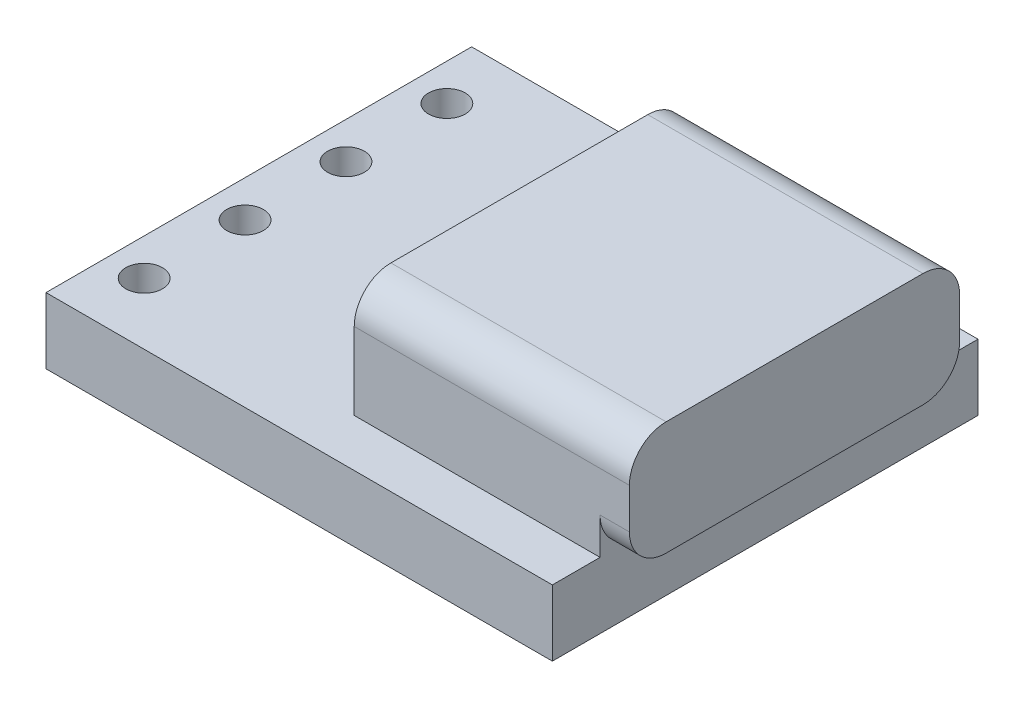
ISO-10303-21;
HEADER;
FILE_DESCRIPTION(('STEP AP214'),'2;1');
FILE_NAME('part.step','',(''),(''),'','','');
FILE_SCHEMA(('AUTOMOTIVE_DESIGN { 1 0 10303 214 1 1 1 1 }'));
ENDSEC;
DATA;
#1=APPLICATION_CONTEXT('core data for automotive mechanical design processes');
#2=APPLICATION_PROTOCOL_DEFINITION('international standard','automotive_design',2000,#1);
#3=PRODUCT_CONTEXT('',#1,'mechanical');
#4=PRODUCT('Part','Part','',(#3));
#5=PRODUCT_RELATED_PRODUCT_CATEGORY('part','',(#4));
#6=PRODUCT_DEFINITION_FORMATION('','',#4);
#7=PRODUCT_DEFINITION_CONTEXT('part definition',#1,'design');
#8=PRODUCT_DEFINITION('design','',#6,#7);
#9=PRODUCT_DEFINITION_SHAPE('','',#8);
#10=(LENGTH_UNIT() NAMED_UNIT(*) SI_UNIT(.MILLI.,.METRE.));
#11=(NAMED_UNIT(*) PLANE_ANGLE_UNIT() SI_UNIT($,.RADIAN.));
#12=(NAMED_UNIT(*) SI_UNIT($,.STERADIAN.) SOLID_ANGLE_UNIT());
#13=UNCERTAINTY_MEASURE_WITH_UNIT(LENGTH_MEASURE(1.E-05),#10,'distance_accuracy_value','');
#14=(GEOMETRIC_REPRESENTATION_CONTEXT(3) GLOBAL_UNCERTAINTY_ASSIGNED_CONTEXT((#13)) GLOBAL_UNIT_ASSIGNED_CONTEXT((#10,
#11,#12)) REPRESENTATION_CONTEXT('',''));
#15=CARTESIAN_POINT('',(0.,0.,0.));
#16=DIRECTION('',(0.,0.,1.));
#17=DIRECTION('',(1.,0.,0.));
#18=AXIS2_PLACEMENT_3D('',#15,#16,#17);
#19=CARTESIAN_POINT('',(6.9,1.8,-5.8));
#20=DIRECTION('',(-1.,0.,0.));
#21=DIRECTION('',(0.,0.,1.));
#22=AXIS2_PLACEMENT_3D('',#19,#20,#21);
#23=PLANE('',#22);
#24=DIRECTION('',(0.,0.,-1.));
#25=VECTOR('',#24,1.);
#26=CARTESIAN_POINT('',(6.9,1.8,-5.8));
#27=LINE('',#26,#25);
#28=CARTESIAN_POINT('',(6.9,1.8,-4.5));
#29=VERTEX_POINT('',#28);
#30=CARTESIAN_POINT('',(6.9,1.8,-5.8));
#31=VERTEX_POINT('',#30);
#32=EDGE_CURVE('E156',#29,#31,#27,.T.);
#33=ORIENTED_EDGE('',*,*,#32,.F.);
#34=DIRECTION('',(0.,-1.,0.));
#35=VECTOR('',#34,1.);
#36=CARTESIAN_POINT('',(6.9,4.9,-4.5));
#37=LINE('',#36,#35);
#38=CARTESIAN_POINT('',(6.9,2.8,-4.5));
#39=VERTEX_POINT('',#38);
#40=EDGE_CURVE('E140',#39,#29,#37,.T.);
#41=ORIENTED_EDGE('',*,*,#40,.F.);
#42=CARTESIAN_POINT('',(6.9,2.8,-3.5));
#43=DIRECTION('',(-1.,0.,0.));
#44=DIRECTION('',(0.,0.,1.));
#45=AXIS2_PLACEMENT_3D('',#42,#43,#44);
#46=CIRCLE('',#45,1.);
#47=CARTESIAN_POINT('',(6.9,1.8,-3.5));
#48=VERTEX_POINT('',#47);
#49=EDGE_CURVE('E45',#39,#48,#46,.T.);
#50=ORIENTED_EDGE('',*,*,#49,.T.);
#51=DIRECTION('',(0.,0.,1.));
#52=VECTOR('',#51,1.);
#53=CARTESIAN_POINT('',(6.9,1.8,4.5));
#54=LINE('',#53,#52);
#55=CARTESIAN_POINT('',(6.9,1.8,3.5));
#56=VERTEX_POINT('',#55);
#57=EDGE_CURVE('E227',#48,#56,#54,.T.);
#58=ORIENTED_EDGE('',*,*,#57,.T.);
#59=CARTESIAN_POINT('',(6.9,2.8,3.5));
#60=DIRECTION('',(-1.,0.,0.));
#61=DIRECTION('',(0.,0.,1.));
#62=AXIS2_PLACEMENT_3D('',#59,#60,#61);
#63=CIRCLE('',#62,1.);
#64=CARTESIAN_POINT('',(6.9,2.8,4.5));
#65=VERTEX_POINT('',#64);
#66=EDGE_CURVE('E11',#56,#65,#63,.T.);
#67=ORIENTED_EDGE('',*,*,#66,.T.);
#68=DIRECTION('',(0.,1.,0.));
#69=VECTOR('',#68,1.);
#70=CARTESIAN_POINT('',(6.9,4.9,4.5));
#71=LINE('',#70,#69);
#72=CARTESIAN_POINT('',(6.9,1.8,4.5));
#73=VERTEX_POINT('',#72);
#74=EDGE_CURVE('E51',#73,#65,#71,.T.);
#75=ORIENTED_EDGE('',*,*,#74,.F.);
#76=CARTESIAN_POINT('',(6.9,1.8,5.8));
#77=VERTEX_POINT('',#76);
#78=EDGE_CURVE('E167',#77,#73,#27,.T.);
#79=ORIENTED_EDGE('',*,*,#78,.F.);
#80=DIRECTION('',(0.,-1.,0.));
#81=VECTOR('',#80,1.);
#82=CARTESIAN_POINT('',(6.9,1.8,5.8));
#83=LINE('',#82,#81);
#84=CARTESIAN_POINT('',(6.9,0.,5.8));
#85=VERTEX_POINT('',#84);
#86=EDGE_CURVE('E181',#77,#85,#83,.T.);
#87=ORIENTED_EDGE('',*,*,#86,.T.);
#88=DIRECTION('',(0.,0.,-1.));
#89=VECTOR('',#88,1.);
#90=CARTESIAN_POINT('',(6.9,0.,-5.8));
#91=LINE('',#90,#89);
#92=CARTESIAN_POINT('',(6.9,0.,-5.8));
#93=VERTEX_POINT('',#92);
#94=EDGE_CURVE('E182',#85,#93,#91,.T.);
#95=ORIENTED_EDGE('',*,*,#94,.T.);
#96=DIRECTION('',(0.,-1.,0.));
#97=VECTOR('',#96,1.);
#98=CARTESIAN_POINT('',(6.9,1.8,-5.8));
#99=LINE('',#98,#97);
#100=EDGE_CURVE('E166',#31,#93,#99,.T.);
#101=ORIENTED_EDGE('',*,*,#100,.F.);
#102=EDGE_LOOP('',(#33,#41,#50,#58,#67,#75,#79,#87,#95,#101));
#103=FACE_BOUND('',#102,.T.);
#104=ADVANCED_FACE('F37',(#103),#23,.F.);
#105=CARTESIAN_POINT('',(0.,1.8,0.));
#106=DIRECTION('',(0.,1.,0.));
#107=DIRECTION('',(0.,0.,1.));
#108=AXIS2_PLACEMENT_3D('',#105,#106,#107);
#109=PLANE('',#108);
#110=CARTESIAN_POINT('',(-5.9,1.8,-4.125));
#111=DIRECTION('',(0.,1.,0.));
#112=DIRECTION('',(0.,0.,1.));
#113=AXIS2_PLACEMENT_3D('',#110,#111,#112);
#114=CIRCLE('',#113,0.500000000000002);
#115=CARTESIAN_POINT('',(-5.9,1.8,-3.625));
#116=VERTEX_POINT('',#115);
#117=EDGE_CURVE('E289',#116,#116,#114,.T.);
#118=ORIENTED_EDGE('',*,*,#117,.F.);
#119=EDGE_LOOP('',(#118));
#120=FACE_BOUND('',#119,.T.);
#121=CARTESIAN_POINT('',(-5.89999999999997,1.8,-1.375));
#122=DIRECTION('',(0.,1.,0.));
#123=DIRECTION('',(0.,0.,1.));
#124=AXIS2_PLACEMENT_3D('',#121,#122,#123);
#125=CIRCLE('',#124,0.500000000000002);
#126=CARTESIAN_POINT('',(-5.89999999999997,1.8,-0.874999999999998));
#127=VERTEX_POINT('',#126);
#128=EDGE_CURVE('E283',#127,#127,#125,.T.);
#129=ORIENTED_EDGE('',*,*,#128,.F.);
#130=EDGE_LOOP('',(#129));
#131=FACE_BOUND('',#130,.T.);
#132=CARTESIAN_POINT('',(-5.89999999999994,1.8,1.375));
#133=DIRECTION('',(0.,1.,0.));
#134=DIRECTION('',(0.,0.,1.));
#135=AXIS2_PLACEMENT_3D('',#132,#133,#134);
#136=CIRCLE('',#135,0.500000000000001);
#137=CARTESIAN_POINT('',(-5.89999999999994,1.8,1.875));
#138=VERTEX_POINT('',#137);
#139=EDGE_CURVE('E276',#138,#138,#136,.T.);
#140=ORIENTED_EDGE('',*,*,#139,.F.);
#141=EDGE_LOOP('',(#140));
#142=FACE_BOUND('',#141,.T.);
#143=CARTESIAN_POINT('',(-5.89999999999991,1.8,4.125));
#144=DIRECTION('',(0.,1.,0.));
#145=DIRECTION('',(0.,0.,1.));
#146=AXIS2_PLACEMENT_3D('',#143,#144,#145);
#147=CIRCLE('',#146,0.500000000000002);
#148=CARTESIAN_POINT('',(-5.89999999999991,1.8,4.625));
#149=VERTEX_POINT('',#148);
#150=EDGE_CURVE('E277',#149,#149,#147,.T.);
#151=ORIENTED_EDGE('',*,*,#150,.F.);
#152=EDGE_LOOP('',(#151));
#153=FACE_BOUND('',#152,.T.);
#154=ORIENTED_EDGE('',*,*,#78,.T.);
#155=DIRECTION('',(-1.,0.,0.));
#156=VECTOR('',#155,1.);
#157=CARTESIAN_POINT('',(0.,1.8,4.5));
#158=LINE('',#157,#156);
#159=CARTESIAN_POINT('',(0.200000000000003,1.8,4.5));
#160=VERTEX_POINT('',#159);
#161=EDGE_CURVE('E161',#73,#160,#158,.T.);
#162=ORIENTED_EDGE('',*,*,#161,.T.);
#163=DIRECTION('',(0.,0.,-1.));
#164=VECTOR('',#163,1.);
#165=CARTESIAN_POINT('',(0.200000000000003,1.8,0.));
#166=LINE('',#165,#164);
#167=CARTESIAN_POINT('',(0.200000000000003,1.8,-4.5));
#168=VERTEX_POINT('',#167);
#169=EDGE_CURVE('E160',#160,#168,#166,.T.);
#170=ORIENTED_EDGE('',*,*,#169,.T.);
#171=DIRECTION('',(1.,0.,0.));
#172=VECTOR('',#171,1.);
#173=CARTESIAN_POINT('',(0.,1.8,-4.5));
#174=LINE('',#173,#172);
#175=EDGE_CURVE('E145',#168,#29,#174,.T.);
#176=ORIENTED_EDGE('',*,*,#175,.T.);
#177=ORIENTED_EDGE('',*,*,#32,.T.);
#178=DIRECTION('',(-1.,0.,0.));
#179=VECTOR('',#178,1.);
#180=CARTESIAN_POINT('',(-6.9,1.8,-5.8));
#181=LINE('',#180,#179);
#182=CARTESIAN_POINT('',(-6.9,1.8,-5.8));
#183=VERTEX_POINT('',#182);
#184=EDGE_CURVE('E170',#31,#183,#181,.T.);
#185=ORIENTED_EDGE('',*,*,#184,.T.);
#186=DIRECTION('',(0.,0.,1.));
#187=VECTOR('',#186,1.);
#188=CARTESIAN_POINT('',(-6.9,1.8,-5.8));
#189=LINE('',#188,#187);
#190=CARTESIAN_POINT('',(-6.9,1.8,5.8));
#191=VERTEX_POINT('',#190);
#192=EDGE_CURVE('E177',#183,#191,#189,.T.);
#193=ORIENTED_EDGE('',*,*,#192,.T.);
#194=DIRECTION('',(1.,0.,0.));
#195=VECTOR('',#194,1.);
#196=CARTESIAN_POINT('',(-6.9,1.8,5.8));
#197=LINE('',#196,#195);
#198=EDGE_CURVE('E179',#191,#77,#197,.T.);
#199=ORIENTED_EDGE('',*,*,#198,.T.);
#200=EDGE_LOOP('',(#154,#162,#170,#176,#177,#185,#193,#199));
#201=FACE_BOUND('',#200,.T.);
#202=ADVANCED_FACE('F155',(#120,#131,#142,#153,#201),#109,.T.);
#203=CARTESIAN_POINT('',(-6.9,1.8,-5.8));
#204=DIRECTION('',(0.,0.,1.));
#205=DIRECTION('',(1.,0.,0.));
#206=AXIS2_PLACEMENT_3D('',#203,#204,#205);
#207=PLANE('',#206);
#208=DIRECTION('',(-1.,0.,0.));
#209=VECTOR('',#208,1.);
#210=CARTESIAN_POINT('',(-6.9,0.,-5.8));
#211=LINE('',#210,#209);
#212=CARTESIAN_POINT('',(-6.9,0.,-5.8));
#213=VERTEX_POINT('',#212);
#214=EDGE_CURVE('E184',#93,#213,#211,.T.);
#215=ORIENTED_EDGE('',*,*,#214,.T.);
#216=DIRECTION('',(0.,-1.,0.));
#217=VECTOR('',#216,1.);
#218=CARTESIAN_POINT('',(-6.9,1.8,-5.8));
#219=LINE('',#218,#217);
#220=EDGE_CURVE('E192',#183,#213,#219,.T.);
#221=ORIENTED_EDGE('',*,*,#220,.F.);
#222=ORIENTED_EDGE('',*,*,#184,.F.);
#223=ORIENTED_EDGE('',*,*,#100,.T.);
#224=EDGE_LOOP('',(#215,#221,#222,#223));
#225=FACE_BOUND('',#224,.T.);
#226=ADVANCED_FACE('F302',(#225),#207,.F.);
#227=CARTESIAN_POINT('',(-6.9,1.8,-5.8));
#228=DIRECTION('',(1.,0.,0.));
#229=DIRECTION('',(0.,0.,-1.));
#230=AXIS2_PLACEMENT_3D('',#227,#228,#229);
#231=PLANE('',#230);
#232=DIRECTION('',(0.,0.,1.));
#233=VECTOR('',#232,1.);
#234=CARTESIAN_POINT('',(-6.9,0.,-5.8));
#235=LINE('',#234,#233);
#236=CARTESIAN_POINT('',(-6.9,0.,5.8));
#237=VERTEX_POINT('',#236);
#238=EDGE_CURVE('E171',#213,#237,#235,.T.);
#239=ORIENTED_EDGE('',*,*,#238,.T.);
#240=DIRECTION('',(0.,-1.,0.));
#241=VECTOR('',#240,1.);
#242=CARTESIAN_POINT('',(-6.9,1.8,5.8));
#243=LINE('',#242,#241);
#244=EDGE_CURVE('E189',#191,#237,#243,.T.);
#245=ORIENTED_EDGE('',*,*,#244,.F.);
#246=ORIENTED_EDGE('',*,*,#192,.F.);
#247=ORIENTED_EDGE('',*,*,#220,.T.);
#248=EDGE_LOOP('',(#239,#245,#246,#247));
#249=FACE_BOUND('',#248,.T.);
#250=ADVANCED_FACE('F334',(#249),#231,.F.);
#251=CARTESIAN_POINT('',(-6.9,1.8,5.8));
#252=DIRECTION('',(0.,0.,-1.));
#253=DIRECTION('',(-1.,0.,0.));
#254=AXIS2_PLACEMENT_3D('',#251,#252,#253);
#255=PLANE('',#254);
#256=DIRECTION('',(1.,0.,0.));
#257=VECTOR('',#256,1.);
#258=CARTESIAN_POINT('',(-6.9,0.,5.8));
#259=LINE('',#258,#257);
#260=EDGE_CURVE('E168',#237,#85,#259,.T.);
#261=ORIENTED_EDGE('',*,*,#260,.T.);
#262=ORIENTED_EDGE('',*,*,#86,.F.);
#263=ORIENTED_EDGE('',*,*,#198,.F.);
#264=ORIENTED_EDGE('',*,*,#244,.T.);
#265=EDGE_LOOP('',(#261,#262,#263,#264));
#266=FACE_BOUND('',#265,.T.);
#267=ADVANCED_FACE('F320',(#266),#255,.F.);
#268=CARTESIAN_POINT('',(0.,0.,0.));
#269=DIRECTION('',(0.,1.,0.));
#270=DIRECTION('',(0.,0.,1.));
#271=AXIS2_PLACEMENT_3D('',#268,#269,#270);
#272=PLANE('',#271);
#273=CARTESIAN_POINT('',(-5.9,0.,-4.125));
#274=DIRECTION('',(0.,1.,0.));
#275=DIRECTION('',(0.,0.,1.));
#276=AXIS2_PLACEMENT_3D('',#273,#274,#275);
#277=CIRCLE('',#276,0.500000000000002);
#278=CARTESIAN_POINT('',(-5.9,0.,-3.625));
#279=VERTEX_POINT('',#278);
#280=EDGE_CURVE('E272',#279,#279,#277,.F.);
#281=ORIENTED_EDGE('',*,*,#280,.F.);
#282=EDGE_LOOP('',(#281));
#283=FACE_BOUND('',#282,.T.);
#284=CARTESIAN_POINT('',(-5.89999999999997,0.,-1.375));
#285=DIRECTION('',(0.,1.,0.));
#286=DIRECTION('',(0.,0.,1.));
#287=AXIS2_PLACEMENT_3D('',#284,#285,#286);
#288=CIRCLE('',#287,0.500000000000002);
#289=CARTESIAN_POINT('',(-5.89999999999997,0.,-0.874999999999998));
#290=VERTEX_POINT('',#289);
#291=EDGE_CURVE('E286',#290,#290,#288,.F.);
#292=ORIENTED_EDGE('',*,*,#291,.F.);
#293=EDGE_LOOP('',(#292));
#294=FACE_BOUND('',#293,.T.);
#295=CARTESIAN_POINT('',(-5.89999999999994,0.,1.375));
#296=DIRECTION('',(0.,1.,0.));
#297=DIRECTION('',(0.,0.,1.));
#298=AXIS2_PLACEMENT_3D('',#295,#296,#297);
#299=CIRCLE('',#298,0.500000000000001);
#300=CARTESIAN_POINT('',(-5.89999999999994,0.,1.875));
#301=VERTEX_POINT('',#300);
#302=EDGE_CURVE('E280',#301,#301,#299,.F.);
#303=ORIENTED_EDGE('',*,*,#302,.F.);
#304=EDGE_LOOP('',(#303));
#305=FACE_BOUND('',#304,.T.);
#306=CARTESIAN_POINT('',(-5.89999999999991,0.,4.125));
#307=DIRECTION('',(0.,1.,0.));
#308=DIRECTION('',(0.,0.,1.));
#309=AXIS2_PLACEMENT_3D('',#306,#307,#308);
#310=CIRCLE('',#309,0.500000000000002);
#311=CARTESIAN_POINT('',(-5.89999999999991,0.,4.625));
#312=VERTEX_POINT('',#311);
#313=EDGE_CURVE('E273',#312,#312,#310,.F.);
#314=ORIENTED_EDGE('',*,*,#313,.F.);
#315=EDGE_LOOP('',(#314));
#316=FACE_BOUND('',#315,.T.);
#317=ORIENTED_EDGE('',*,*,#214,.F.);
#318=ORIENTED_EDGE('',*,*,#94,.F.);
#319=ORIENTED_EDGE('',*,*,#260,.F.);
#320=ORIENTED_EDGE('',*,*,#238,.F.);
#321=EDGE_LOOP('',(#317,#318,#319,#320));
#322=FACE_BOUND('',#321,.T.);
#323=ADVANCED_FACE('F317',(#283,#294,#305,#316,#322),#272,.F.);
#324=CARTESIAN_POINT('',(0.,4.9,4.5));
#325=DIRECTION('',(0.,0.,-1.));
#326=DIRECTION('',(-1.,0.,0.));
#327=AXIS2_PLACEMENT_3D('',#324,#325,#326);
#328=PLANE('',#327);
#329=ORIENTED_EDGE('',*,*,#74,.T.);
#330=DIRECTION('',(1.,0.,0.));
#331=VECTOR('',#330,1.);
#332=CARTESIAN_POINT('',(0.,2.8,4.5));
#333=LINE('',#332,#331);
#334=CARTESIAN_POINT('',(7.7,2.8,4.5));
#335=VERTEX_POINT('',#334);
#336=EDGE_CURVE('E214',#65,#335,#333,.T.);
#337=ORIENTED_EDGE('',*,*,#336,.T.);
#338=DIRECTION('',(0.,-1.,0.));
#339=VECTOR('',#338,1.);
#340=CARTESIAN_POINT('',(7.7,4.9,4.5));
#341=LINE('',#340,#339);
#342=CARTESIAN_POINT('',(7.7,3.9,4.5));
#343=VERTEX_POINT('',#342);
#344=EDGE_CURVE('E246',#343,#335,#341,.T.);
#345=ORIENTED_EDGE('',*,*,#344,.F.);
#346=DIRECTION('',(1.,0.,0.));
#347=VECTOR('',#346,1.);
#348=CARTESIAN_POINT('',(0.200000000000003,3.9,4.5));
#349=LINE('',#348,#347);
#350=CARTESIAN_POINT('',(0.200000000000003,3.9,4.5));
#351=VERTEX_POINT('',#350);
#352=EDGE_CURVE('E211',#343,#351,#349,.F.);
#353=ORIENTED_EDGE('',*,*,#352,.T.);
#354=DIRECTION('',(0.,-1.,0.));
#355=VECTOR('',#354,1.);
#356=CARTESIAN_POINT('',(0.200000000000003,4.9,4.5));
#357=LINE('',#356,#355);
#358=EDGE_CURVE('E162',#351,#160,#357,.T.);
#359=ORIENTED_EDGE('',*,*,#358,.T.);
#360=ORIENTED_EDGE('',*,*,#161,.F.);
#361=EDGE_LOOP('',(#329,#337,#345,#353,#359,#360));
#362=FACE_BOUND('',#361,.T.);
#363=ADVANCED_FACE('F256',(#362),#328,.F.);
#364=CARTESIAN_POINT('',(0.,4.9,-4.5));
#365=DIRECTION('',(0.,0.,1.));
#366=DIRECTION('',(1.,0.,0.));
#367=AXIS2_PLACEMENT_3D('',#364,#365,#366);
#368=PLANE('',#367);
#369=DIRECTION('',(0.,-1.,0.));
#370=VECTOR('',#369,1.);
#371=CARTESIAN_POINT('',(7.7,4.9,-4.5));
#372=LINE('',#371,#370);
#373=CARTESIAN_POINT('',(7.7,3.9,-4.5));
#374=VERTEX_POINT('',#373);
#375=CARTESIAN_POINT('',(7.7,2.8,-4.5));
#376=VERTEX_POINT('',#375);
#377=EDGE_CURVE('E243',#374,#376,#372,.T.);
#378=ORIENTED_EDGE('',*,*,#377,.T.);
#379=DIRECTION('',(1.,0.,0.));
#380=VECTOR('',#379,1.);
#381=CARTESIAN_POINT('',(0.,2.8,-4.5));
#382=LINE('',#381,#380);
#383=EDGE_CURVE('E148',#376,#39,#382,.F.);
#384=ORIENTED_EDGE('',*,*,#383,.T.);
#385=ORIENTED_EDGE('',*,*,#40,.T.);
#386=ORIENTED_EDGE('',*,*,#175,.F.);
#387=DIRECTION('',(0.,-1.,0.));
#388=VECTOR('',#387,1.);
#389=CARTESIAN_POINT('',(0.200000000000003,4.9,-4.5));
#390=LINE('',#389,#388);
#391=CARTESIAN_POINT('',(0.200000000000003,3.9,-4.5));
#392=VERTEX_POINT('',#391);
#393=EDGE_CURVE('E247',#392,#168,#390,.T.);
#394=ORIENTED_EDGE('',*,*,#393,.F.);
#395=DIRECTION('',(-1.,0.,0.));
#396=VECTOR('',#395,1.);
#397=CARTESIAN_POINT('',(7.7,3.9,-4.5));
#398=LINE('',#397,#396);
#399=EDGE_CURVE('E151',#392,#374,#398,.F.);
#400=ORIENTED_EDGE('',*,*,#399,.T.);
#401=EDGE_LOOP('',(#378,#384,#385,#386,#394,#400));
#402=FACE_BOUND('',#401,.T.);
#403=ADVANCED_FACE('F143',(#402),#368,.F.);
#404=CARTESIAN_POINT('',(0.200000000000003,4.9,0.));
#405=DIRECTION('',(1.,0.,0.));
#406=DIRECTION('',(0.,0.,-1.));
#407=AXIS2_PLACEMENT_3D('',#404,#405,#406);
#408=PLANE('',#407);
#409=DIRECTION('',(0.,0.,1.));
#410=VECTOR('',#409,1.);
#411=CARTESIAN_POINT('',(0.200000000000003,4.9,0.));
#412=LINE('',#411,#410);
#413=CARTESIAN_POINT('',(0.200000000000003,4.9,-3.5));
#414=VERTEX_POINT('',#413);
#415=CARTESIAN_POINT('',(0.200000000000003,4.9,3.5));
#416=VERTEX_POINT('',#415);
#417=EDGE_CURVE('E236',#414,#416,#412,.T.);
#418=ORIENTED_EDGE('',*,*,#417,.F.);
#419=CARTESIAN_POINT('',(0.200000000000003,3.9,-3.5));
#420=DIRECTION('',(1.,0.,0.));
#421=DIRECTION('',(0.,0.,-1.));
#422=AXIS2_PLACEMENT_3D('',#419,#420,#421);
#423=CIRCLE('',#422,1.);
#424=EDGE_CURVE('E224',#414,#392,#423,.F.);
#425=ORIENTED_EDGE('',*,*,#424,.T.);
#426=ORIENTED_EDGE('',*,*,#393,.T.);
#427=ORIENTED_EDGE('',*,*,#169,.F.);
#428=ORIENTED_EDGE('',*,*,#358,.F.);
#429=CARTESIAN_POINT('',(0.200000000000003,3.9,3.5));
#430=DIRECTION('',(1.,0.,0.));
#431=DIRECTION('',(0.,0.,-1.));
#432=AXIS2_PLACEMENT_3D('',#429,#430,#431);
#433=CIRCLE('',#432,1.);
#434=EDGE_CURVE('E59',#351,#416,#433,.F.);
#435=ORIENTED_EDGE('',*,*,#434,.T.);
#436=EDGE_LOOP('',(#418,#425,#426,#427,#428,#435));
#437=FACE_BOUND('',#436,.T.);
#438=ADVANCED_FACE('F260',(#437),#408,.F.);
#439=CARTESIAN_POINT('',(7.7,4.9,0.));
#440=DIRECTION('',(-1.,0.,0.));
#441=DIRECTION('',(0.,0.,1.));
#442=AXIS2_PLACEMENT_3D('',#439,#440,#441);
#443=PLANE('',#442);
#444=DIRECTION('',(0.,0.,1.));
#445=VECTOR('',#444,1.);
#446=CARTESIAN_POINT('',(7.7,1.8,4.5));
#447=LINE('',#446,#445);
#448=CARTESIAN_POINT('',(7.7,1.8,-3.5));
#449=VERTEX_POINT('',#448);
#450=CARTESIAN_POINT('',(7.7,1.8,3.5));
#451=VERTEX_POINT('',#450);
#452=EDGE_CURVE('E237',#449,#451,#447,.T.);
#453=ORIENTED_EDGE('',*,*,#452,.F.);
#454=CARTESIAN_POINT('',(7.7,2.8,-3.5));
#455=DIRECTION('',(-1.,0.,0.));
#456=DIRECTION('',(0.,0.,1.));
#457=AXIS2_PLACEMENT_3D('',#454,#455,#456);
#458=CIRCLE('',#457,1.);
#459=EDGE_CURVE('E207',#449,#376,#458,.F.);
#460=ORIENTED_EDGE('',*,*,#459,.T.);
#461=ORIENTED_EDGE('',*,*,#377,.F.);
#462=CARTESIAN_POINT('',(7.7,3.9,-3.5));
#463=DIRECTION('',(-1.,0.,0.));
#464=DIRECTION('',(0.,0.,1.));
#465=AXIS2_PLACEMENT_3D('',#462,#463,#464);
#466=CIRCLE('',#465,1.);
#467=CARTESIAN_POINT('',(7.7,4.9,-3.5));
#468=VERTEX_POINT('',#467);
#469=EDGE_CURVE('E203',#374,#468,#466,.F.);
#470=ORIENTED_EDGE('',*,*,#469,.T.);
#471=DIRECTION('',(0.,0.,-1.));
#472=VECTOR('',#471,1.);
#473=CARTESIAN_POINT('',(7.7,4.9,0.));
#474=LINE('',#473,#472);
#475=CARTESIAN_POINT('',(7.7,4.9,3.5));
#476=VERTEX_POINT('',#475);
#477=EDGE_CURVE('E251',#476,#468,#474,.T.);
#478=ORIENTED_EDGE('',*,*,#477,.F.);
#479=CARTESIAN_POINT('',(7.7,3.9,3.5));
#480=DIRECTION('',(-1.,0.,0.));
#481=DIRECTION('',(0.,0.,1.));
#482=AXIS2_PLACEMENT_3D('',#479,#480,#481);
#483=CIRCLE('',#482,1.);
#484=EDGE_CURVE('E201',#476,#343,#483,.F.);
#485=ORIENTED_EDGE('',*,*,#484,.T.);
#486=ORIENTED_EDGE('',*,*,#344,.T.);
#487=CARTESIAN_POINT('',(7.7,2.8,3.5));
#488=DIRECTION('',(-1.,0.,0.));
#489=DIRECTION('',(0.,0.,1.));
#490=AXIS2_PLACEMENT_3D('',#487,#488,#489);
#491=CIRCLE('',#490,1.);
#492=EDGE_CURVE('E205',#335,#451,#491,.F.);
#493=ORIENTED_EDGE('',*,*,#492,.T.);
#494=EDGE_LOOP('',(#453,#460,#461,#470,#478,#485,#486,#493));
#495=FACE_BOUND('',#494,.T.);
#496=ADVANCED_FACE('F242',(#495),#443,.F.);
#497=CARTESIAN_POINT('',(0.,4.9,0.));
#498=DIRECTION('',(0.,1.,0.));
#499=DIRECTION('',(0.,0.,1.));
#500=AXIS2_PLACEMENT_3D('',#497,#498,#499);
#501=PLANE('',#500);
#502=ORIENTED_EDGE('',*,*,#477,.T.);
#503=DIRECTION('',(-1.,0.,0.));
#504=VECTOR('',#503,1.);
#505=CARTESIAN_POINT('',(0.200000000000003,4.9,-3.5));
#506=LINE('',#505,#504);
#507=EDGE_CURVE('E220',#468,#414,#506,.T.);
#508=ORIENTED_EDGE('',*,*,#507,.T.);
#509=ORIENTED_EDGE('',*,*,#417,.T.);
#510=DIRECTION('',(1.,0.,0.));
#511=VECTOR('',#510,1.);
#512=CARTESIAN_POINT('',(7.7,4.9,3.5));
#513=LINE('',#512,#511);
#514=EDGE_CURVE('E217',#416,#476,#513,.T.);
#515=ORIENTED_EDGE('',*,*,#514,.T.);
#516=EDGE_LOOP('',(#502,#508,#509,#515));
#517=FACE_BOUND('',#516,.T.);
#518=ADVANCED_FACE('F267',(#517),#501,.T.);
#519=CARTESIAN_POINT('',(-2.27823512446701,1.8,4.5));
#520=DIRECTION('',(0.,1.,0.));
#521=DIRECTION('',(0.,0.,1.));
#522=AXIS2_PLACEMENT_3D('',#519,#520,#521);
#523=PLANE('',#522);
#524=ORIENTED_EDGE('',*,*,#57,.F.);
#525=DIRECTION('',(1.,0.,0.));
#526=VECTOR('',#525,1.);
#527=CARTESIAN_POINT('',(-2.27823512446701,1.8,-3.5));
#528=LINE('',#527,#526);
#529=EDGE_CURVE('E198',#48,#449,#528,.T.);
#530=ORIENTED_EDGE('',*,*,#529,.T.);
#531=ORIENTED_EDGE('',*,*,#452,.T.);
#532=DIRECTION('',(1.,0.,0.));
#533=VECTOR('',#532,1.);
#534=CARTESIAN_POINT('',(-2.27823512446701,1.8,3.5));
#535=LINE('',#534,#533);
#536=EDGE_CURVE('E196',#451,#56,#535,.F.);
#537=ORIENTED_EDGE('',*,*,#536,.T.);
#538=EDGE_LOOP('',(#524,#530,#531,#537));
#539=FACE_BOUND('',#538,.T.);
#540=ADVANCED_FACE('F232',(#539),#523,.F.);
#541=CARTESIAN_POINT('',(-2.27823512446701,2.8,-3.5));
#542=DIRECTION('',(1.,0.,0.));
#543=DIRECTION('',(0.,0.,-1.));
#544=AXIS2_PLACEMENT_3D('',#541,#542,#543);
#545=CYLINDRICAL_SURFACE('',#544,1.);
#546=ORIENTED_EDGE('',*,*,#49,.F.);
#547=ORIENTED_EDGE('',*,*,#383,.F.);
#548=ORIENTED_EDGE('',*,*,#459,.F.);
#549=ORIENTED_EDGE('',*,*,#529,.F.);
#550=EDGE_LOOP('',(#546,#547,#548,#549));
#551=FACE_BOUND('',#550,.T.);
#552=ADVANCED_FACE('F239',(#551),#545,.T.);
#553=CARTESIAN_POINT('',(0.,2.8,3.5));
#554=DIRECTION('',(1.,0.,0.));
#555=DIRECTION('',(0.,0.,-1.));
#556=AXIS2_PLACEMENT_3D('',#553,#554,#555);
#557=CYLINDRICAL_SURFACE('',#556,1.);
#558=ORIENTED_EDGE('',*,*,#66,.F.);
#559=ORIENTED_EDGE('',*,*,#536,.F.);
#560=ORIENTED_EDGE('',*,*,#492,.F.);
#561=ORIENTED_EDGE('',*,*,#336,.F.);
#562=EDGE_LOOP('',(#558,#559,#560,#561));
#563=FACE_BOUND('',#562,.T.);
#564=ADVANCED_FACE('F352',(#563),#557,.T.);
#565=CARTESIAN_POINT('',(0.,3.9,-3.5));
#566=DIRECTION('',(1.,0.,0.));
#567=DIRECTION('',(0.,0.,-1.));
#568=AXIS2_PLACEMENT_3D('',#565,#566,#567);
#569=CYLINDRICAL_SURFACE('',#568,1.);
#570=ORIENTED_EDGE('',*,*,#469,.F.);
#571=ORIENTED_EDGE('',*,*,#399,.F.);
#572=ORIENTED_EDGE('',*,*,#424,.F.);
#573=ORIENTED_EDGE('',*,*,#507,.F.);
#574=EDGE_LOOP('',(#570,#571,#572,#573));
#575=FACE_BOUND('',#574,.T.);
#576=ADVANCED_FACE('F262',(#575),#569,.T.);
#577=CARTESIAN_POINT('',(0.,3.9,3.5));
#578=DIRECTION('',(-1.,0.,0.));
#579=DIRECTION('',(0.,0.,1.));
#580=AXIS2_PLACEMENT_3D('',#577,#578,#579);
#581=CYLINDRICAL_SURFACE('',#580,1.);
#582=ORIENTED_EDGE('',*,*,#434,.F.);
#583=ORIENTED_EDGE('',*,*,#352,.F.);
#584=ORIENTED_EDGE('',*,*,#484,.F.);
#585=ORIENTED_EDGE('',*,*,#514,.F.);
#586=EDGE_LOOP('',(#582,#583,#584,#585));
#587=FACE_BOUND('',#586,.T.);
#588=ADVANCED_FACE('F39',(#587),#581,.T.);
#589=CARTESIAN_POINT('',(-5.89999999999991,-0.000999999999999916,4.125));
#590=DIRECTION('',(0.,1.,0.));
#591=DIRECTION('',(0.,0.,1.));
#592=AXIS2_PLACEMENT_3D('',#589,#590,#591);
#593=CYLINDRICAL_SURFACE('',#592,0.500000000000002);
#594=ORIENTED_EDGE('',*,*,#150,.T.);
#595=EDGE_LOOP('',(#594));
#596=FACE_BOUND('',#595,.T.);
#597=ORIENTED_EDGE('',*,*,#313,.T.);
#598=EDGE_LOOP('',(#597));
#599=FACE_BOUND('',#598,.T.);
#600=ADVANCED_FACE('F310',(#596,#599),#593,.F.);
#601=CARTESIAN_POINT('',(-5.89999999999994,-0.000999999999999916,1.375));
#602=DIRECTION('',(0.,1.,0.));
#603=DIRECTION('',(0.,0.,1.));
#604=AXIS2_PLACEMENT_3D('',#601,#602,#603);
#605=CYLINDRICAL_SURFACE('',#604,0.500000000000001);
#606=ORIENTED_EDGE('',*,*,#139,.T.);
#607=EDGE_LOOP('',(#606));
#608=FACE_BOUND('',#607,.T.);
#609=ORIENTED_EDGE('',*,*,#302,.T.);
#610=EDGE_LOOP('',(#609));
#611=FACE_BOUND('',#610,.T.);
#612=ADVANCED_FACE('F313',(#608,#611),#605,.F.);
#613=CARTESIAN_POINT('',(-5.89999999999997,-0.000999999999999916,-1.375));
#614=DIRECTION('',(0.,1.,0.));
#615=DIRECTION('',(0.,0.,1.));
#616=AXIS2_PLACEMENT_3D('',#613,#614,#615);
#617=CYLINDRICAL_SURFACE('',#616,0.500000000000002);
#618=ORIENTED_EDGE('',*,*,#128,.T.);
#619=EDGE_LOOP('',(#618));
#620=FACE_BOUND('',#619,.T.);
#621=ORIENTED_EDGE('',*,*,#291,.T.);
#622=EDGE_LOOP('',(#621));
#623=FACE_BOUND('',#622,.T.);
#624=ADVANCED_FACE('F372',(#620,#623),#617,.F.);
#625=CARTESIAN_POINT('',(-5.9,-0.000999999999999916,-4.125));
#626=DIRECTION('',(0.,1.,0.));
#627=DIRECTION('',(0.,0.,1.));
#628=AXIS2_PLACEMENT_3D('',#625,#626,#627);
#629=CYLINDRICAL_SURFACE('',#628,0.500000000000002);
#630=ORIENTED_EDGE('',*,*,#117,.T.);
#631=EDGE_LOOP('',(#630));
#632=FACE_BOUND('',#631,.T.);
#633=ORIENTED_EDGE('',*,*,#280,.T.);
#634=EDGE_LOOP('',(#633));
#635=FACE_BOUND('',#634,.T.);
#636=ADVANCED_FACE('F297',(#632,#635),#629,.F.);
#637=CLOSED_SHELL('',(#104,#202,#226,#250,#267,#323,#363,#403,#438,#496,#518,#540,#552,#564,
#576,#588,#600,#612,#624,#636));
#638=MANIFOLD_SOLID_BREP('B2',#637);
#639=ADVANCED_BREP_SHAPE_REPRESENTATION('',(#18,#638),#14);
#640=SHAPE_DEFINITION_REPRESENTATION(#9,#639);
ENDSEC;
END-ISO-10303-21;
